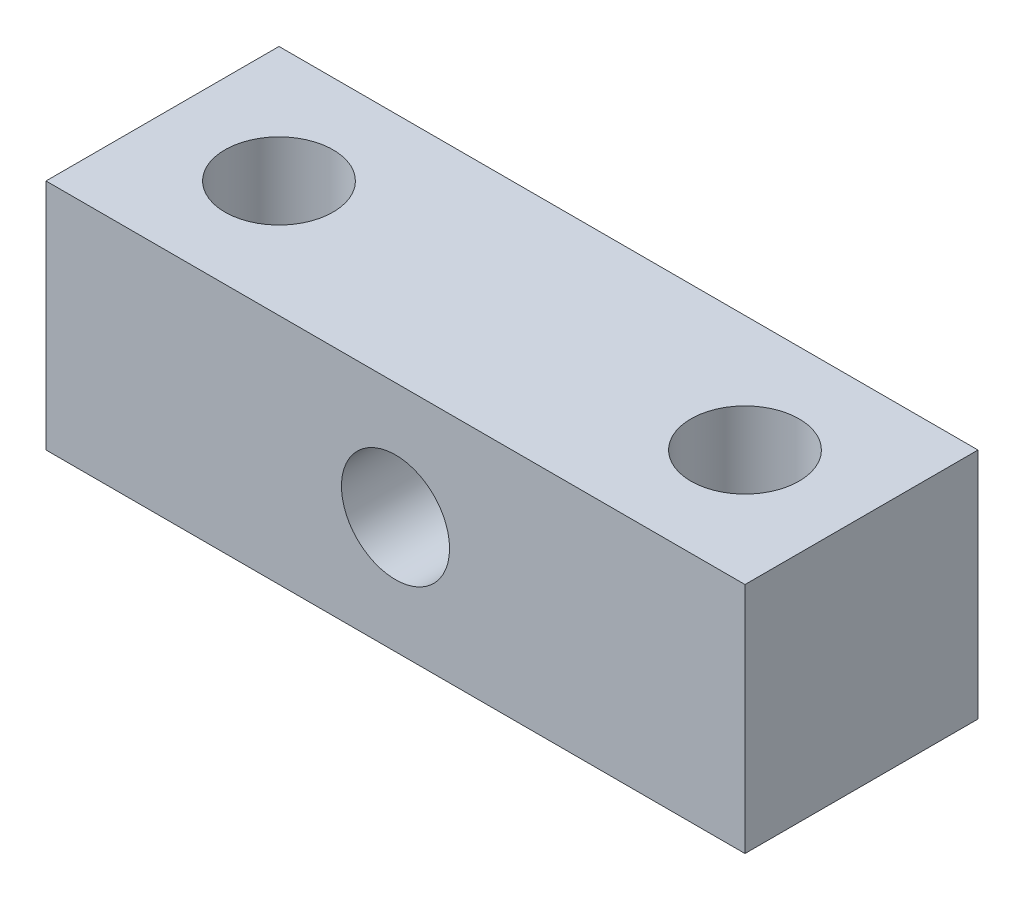
ISO-10303-21;
HEADER;
FILE_DESCRIPTION(('STEP AP214'),'2;1');
FILE_NAME('part.step','',(''),(''),'','','');
FILE_SCHEMA(('AUTOMOTIVE_DESIGN { 1 0 10303 214 1 1 1 1 }'));
ENDSEC;
DATA;
#1=APPLICATION_CONTEXT('core data for automotive mechanical design processes');
#2=APPLICATION_PROTOCOL_DEFINITION('international standard','automotive_design',2000,#1);
#3=PRODUCT_CONTEXT('',#1,'mechanical');
#4=PRODUCT('Part','Part','',(#3));
#5=PRODUCT_RELATED_PRODUCT_CATEGORY('part','',(#4));
#6=PRODUCT_DEFINITION_FORMATION('','',#4);
#7=PRODUCT_DEFINITION_CONTEXT('part definition',#1,'design');
#8=PRODUCT_DEFINITION('design','',#6,#7);
#9=PRODUCT_DEFINITION_SHAPE('','',#8);
#10=(LENGTH_UNIT() NAMED_UNIT(*) SI_UNIT(.MILLI.,.METRE.));
#11=(NAMED_UNIT(*) PLANE_ANGLE_UNIT() SI_UNIT($,.RADIAN.));
#12=(NAMED_UNIT(*) SI_UNIT($,.STERADIAN.) SOLID_ANGLE_UNIT());
#13=UNCERTAINTY_MEASURE_WITH_UNIT(LENGTH_MEASURE(1.E-05),#10,'distance_accuracy_value','');
#14=(GEOMETRIC_REPRESENTATION_CONTEXT(3) GLOBAL_UNCERTAINTY_ASSIGNED_CONTEXT((#13)) GLOBAL_UNIT_ASSIGNED_CONTEXT((#10,
#11,#12)) REPRESENTATION_CONTEXT('',''));
#15=CARTESIAN_POINT('',(0.,0.,0.));
#16=DIRECTION('',(0.,0.,1.));
#17=DIRECTION('',(1.,0.,0.));
#18=AXIS2_PLACEMENT_3D('',#15,#16,#17);
#19=CARTESIAN_POINT('',(-9.525,3.175,6.35));
#20=DIRECTION('',(1.,0.,0.));
#21=DIRECTION('',(0.,0.,-1.));
#22=AXIS2_PLACEMENT_3D('',#19,#20,#21);
#23=PLANE('',#22);
#24=DIRECTION('',(0.,-1.,0.));
#25=VECTOR('',#24,1.);
#26=CARTESIAN_POINT('',(-9.525,3.175,0.));
#27=LINE('',#26,#25);
#28=CARTESIAN_POINT('',(-9.525,3.175,0.));
#29=VERTEX_POINT('',#28);
#30=CARTESIAN_POINT('',(-9.525,-3.175,0.));
#31=VERTEX_POINT('',#30);
#32=EDGE_CURVE('E98',#29,#31,#27,.T.);
#33=ORIENTED_EDGE('',*,*,#32,.T.);
#34=DIRECTION('',(0.,0.,-1.));
#35=VECTOR('',#34,1.);
#36=CARTESIAN_POINT('',(-9.525,-3.175,6.35));
#37=LINE('',#36,#35);
#38=CARTESIAN_POINT('',(-9.525,-3.175,6.35));
#39=VERTEX_POINT('',#38);
#40=EDGE_CURVE('E11',#39,#31,#37,.T.);
#41=ORIENTED_EDGE('',*,*,#40,.F.);
#42=DIRECTION('',(0.,-1.,0.));
#43=VECTOR('',#42,1.);
#44=CARTESIAN_POINT('',(-9.525,3.175,6.35));
#45=LINE('',#44,#43);
#46=CARTESIAN_POINT('',(-9.525,3.175,6.35));
#47=VERTEX_POINT('',#46);
#48=EDGE_CURVE('E86',#47,#39,#45,.T.);
#49=ORIENTED_EDGE('',*,*,#48,.F.);
#50=DIRECTION('',(0.,0.,-1.));
#51=VECTOR('',#50,1.);
#52=CARTESIAN_POINT('',(-9.525,3.175,6.35));
#53=LINE('',#52,#51);
#54=EDGE_CURVE('E94',#47,#29,#53,.T.);
#55=ORIENTED_EDGE('',*,*,#54,.T.);
#56=EDGE_LOOP('',(#33,#41,#49,#55));
#57=FACE_BOUND('',#56,.T.);
#58=ADVANCED_FACE('F35',(#57),#23,.F.);
#59=CARTESIAN_POINT('',(-9.525,-3.175,6.35));
#60=DIRECTION('',(0.,1.,0.));
#61=DIRECTION('',(0.,0.,1.));
#62=AXIS2_PLACEMENT_3D('',#59,#60,#61);
#63=PLANE('',#62);
#64=CARTESIAN_POINT('',(-6.35,-3.175,3.175));
#65=DIRECTION('',(0.,1.,0.));
#66=DIRECTION('',(0.,0.,1.));
#67=AXIS2_PLACEMENT_3D('',#64,#65,#66);
#68=CIRCLE('',#67,1.4732);
#69=CARTESIAN_POINT('',(-6.35,-3.175,4.6482));
#70=VERTEX_POINT('',#69);
#71=EDGE_CURVE('E117',#70,#70,#68,.T.);
#72=ORIENTED_EDGE('',*,*,#71,.T.);
#73=EDGE_LOOP('',(#72));
#74=FACE_BOUND('',#73,.T.);
#75=CARTESIAN_POINT('',(6.35,-3.175,3.175));
#76=DIRECTION('',(0.,1.,0.));
#77=DIRECTION('',(0.,0.,1.));
#78=AXIS2_PLACEMENT_3D('',#75,#76,#77);
#79=CIRCLE('',#78,1.4732);
#80=CARTESIAN_POINT('',(6.35,-3.175,4.6482));
#81=VERTEX_POINT('',#80);
#82=EDGE_CURVE('E101',#81,#81,#79,.T.);
#83=ORIENTED_EDGE('',*,*,#82,.T.);
#84=EDGE_LOOP('',(#83));
#85=FACE_BOUND('',#84,.T.);
#86=DIRECTION('',(1.,0.,0.));
#87=VECTOR('',#86,1.);
#88=CARTESIAN_POINT('',(-9.525,-3.175,0.));
#89=LINE('',#88,#87);
#90=CARTESIAN_POINT('',(9.525,-3.175,0.));
#91=VERTEX_POINT('',#90);
#92=EDGE_CURVE('E90',#31,#91,#89,.T.);
#93=ORIENTED_EDGE('',*,*,#92,.T.);
#94=DIRECTION('',(0.,0.,-1.));
#95=VECTOR('',#94,1.);
#96=CARTESIAN_POINT('',(9.525,-3.175,6.35));
#97=LINE('',#96,#95);
#98=CARTESIAN_POINT('',(9.525,-3.175,6.35));
#99=VERTEX_POINT('',#98);
#100=EDGE_CURVE('E43',#99,#91,#97,.T.);
#101=ORIENTED_EDGE('',*,*,#100,.F.);
#102=DIRECTION('',(1.,0.,0.));
#103=VECTOR('',#102,1.);
#104=CARTESIAN_POINT('',(-9.525,-3.175,6.35));
#105=LINE('',#104,#103);
#106=EDGE_CURVE('E81',#39,#99,#105,.T.);
#107=ORIENTED_EDGE('',*,*,#106,.F.);
#108=ORIENTED_EDGE('',*,*,#40,.T.);
#109=EDGE_LOOP('',(#93,#101,#107,#108));
#110=FACE_BOUND('',#109,.T.);
#111=ADVANCED_FACE('F89',(#74,#85,#110),#63,.F.);
#112=CARTESIAN_POINT('',(9.525,3.175,6.35));
#113=DIRECTION('',(-1.,0.,0.));
#114=DIRECTION('',(0.,0.,1.));
#115=AXIS2_PLACEMENT_3D('',#112,#113,#114);
#116=PLANE('',#115);
#117=DIRECTION('',(0.,1.,0.));
#118=VECTOR('',#117,1.);
#119=CARTESIAN_POINT('',(9.525,3.175,0.));
#120=LINE('',#119,#118);
#121=CARTESIAN_POINT('',(9.525,3.175,0.));
#122=VERTEX_POINT('',#121);
#123=EDGE_CURVE('E68',#91,#122,#120,.T.);
#124=ORIENTED_EDGE('',*,*,#123,.T.);
#125=DIRECTION('',(0.,0.,-1.));
#126=VECTOR('',#125,1.);
#127=CARTESIAN_POINT('',(9.525,3.175,6.35));
#128=LINE('',#127,#126);
#129=CARTESIAN_POINT('',(9.525,3.175,6.35));
#130=VERTEX_POINT('',#129);
#131=EDGE_CURVE('E91',#130,#122,#128,.T.);
#132=ORIENTED_EDGE('',*,*,#131,.F.);
#133=DIRECTION('',(0.,1.,0.));
#134=VECTOR('',#133,1.);
#135=CARTESIAN_POINT('',(9.525,3.175,6.35));
#136=LINE('',#135,#134);
#137=EDGE_CURVE('E84',#99,#130,#136,.T.);
#138=ORIENTED_EDGE('',*,*,#137,.F.);
#139=ORIENTED_EDGE('',*,*,#100,.T.);
#140=EDGE_LOOP('',(#124,#132,#138,#139));
#141=FACE_BOUND('',#140,.T.);
#142=ADVANCED_FACE('F92',(#141),#116,.F.);
#143=CARTESIAN_POINT('',(-9.525,3.175,6.35));
#144=DIRECTION('',(0.,-1.,0.));
#145=DIRECTION('',(0.,0.,-1.));
#146=AXIS2_PLACEMENT_3D('',#143,#144,#145);
#147=PLANE('',#146);
#148=CARTESIAN_POINT('',(-6.35,3.175,3.175));
#149=DIRECTION('',(0.,1.,0.));
#150=DIRECTION('',(0.,0.,1.));
#151=AXIS2_PLACEMENT_3D('',#148,#149,#150);
#152=CIRCLE('',#151,1.47319999999999);
#153=CARTESIAN_POINT('',(-6.35,3.175,4.64819999999999));
#154=VERTEX_POINT('',#153);
#155=EDGE_CURVE('E120',#154,#154,#152,.T.);
#156=ORIENTED_EDGE('',*,*,#155,.F.);
#157=EDGE_LOOP('',(#156));
#158=FACE_BOUND('',#157,.T.);
#159=CARTESIAN_POINT('',(6.35,3.175,3.175));
#160=DIRECTION('',(0.,1.,0.));
#161=DIRECTION('',(0.,0.,1.));
#162=AXIS2_PLACEMENT_3D('',#159,#160,#161);
#163=CIRCLE('',#162,1.47319999999999);
#164=CARTESIAN_POINT('',(6.35,3.175,4.64819999999999));
#165=VERTEX_POINT('',#164);
#166=EDGE_CURVE('E114',#165,#165,#163,.T.);
#167=ORIENTED_EDGE('',*,*,#166,.F.);
#168=EDGE_LOOP('',(#167));
#169=FACE_BOUND('',#168,.T.);
#170=DIRECTION('',(-1.,0.,0.));
#171=VECTOR('',#170,1.);
#172=CARTESIAN_POINT('',(-9.525,3.175,0.));
#173=LINE('',#172,#171);
#174=EDGE_CURVE('E74',#122,#29,#173,.T.);
#175=ORIENTED_EDGE('',*,*,#174,.T.);
#176=ORIENTED_EDGE('',*,*,#54,.F.);
#177=DIRECTION('',(-1.,0.,0.));
#178=VECTOR('',#177,1.);
#179=CARTESIAN_POINT('',(-9.525,3.175,6.35));
#180=LINE('',#179,#178);
#181=EDGE_CURVE('E51',#130,#47,#180,.T.);
#182=ORIENTED_EDGE('',*,*,#181,.F.);
#183=ORIENTED_EDGE('',*,*,#131,.T.);
#184=EDGE_LOOP('',(#175,#176,#182,#183));
#185=FACE_BOUND('',#184,.T.);
#186=ADVANCED_FACE('F106',(#158,#169,#185),#147,.F.);
#187=CARTESIAN_POINT('',(0.,0.,6.35));
#188=DIRECTION('',(0.,0.,1.));
#189=DIRECTION('',(1.,0.,0.));
#190=AXIS2_PLACEMENT_3D('',#187,#188,#189);
#191=PLANE('',#190);
#192=CARTESIAN_POINT('',(0.,0.,6.35));
#193=DIRECTION('',(0.,0.,1.));
#194=DIRECTION('',(1.,0.,0.));
#195=AXIS2_PLACEMENT_3D('',#192,#193,#194);
#196=CIRCLE('',#195,1.47319999999999);
#197=CARTESIAN_POINT('',(1.47319999999999,0.,6.35));
#198=VERTEX_POINT('',#197);
#199=EDGE_CURVE('E126',#198,#198,#196,.T.);
#200=ORIENTED_EDGE('',*,*,#199,.F.);
#201=EDGE_LOOP('',(#200));
#202=FACE_BOUND('',#201,.T.);
#203=ORIENTED_EDGE('',*,*,#48,.T.);
#204=ORIENTED_EDGE('',*,*,#106,.T.);
#205=ORIENTED_EDGE('',*,*,#137,.T.);
#206=ORIENTED_EDGE('',*,*,#181,.T.);
#207=EDGE_LOOP('',(#203,#204,#205,#206));
#208=FACE_BOUND('',#207,.T.);
#209=ADVANCED_FACE('F82',(#202,#208),#191,.T.);
#210=CARTESIAN_POINT('',(0.,0.,0.));
#211=DIRECTION('',(0.,0.,1.));
#212=DIRECTION('',(1.,0.,0.));
#213=AXIS2_PLACEMENT_3D('',#210,#211,#212);
#214=PLANE('',#213);
#215=CARTESIAN_POINT('',(0.,0.,0.));
#216=DIRECTION('',(0.,0.,1.));
#217=DIRECTION('',(1.,0.,0.));
#218=AXIS2_PLACEMENT_3D('',#215,#216,#217);
#219=CIRCLE('',#218,1.4732);
#220=CARTESIAN_POINT('',(1.4732,0.,0.));
#221=VERTEX_POINT('',#220);
#222=EDGE_CURVE('E123',#221,#221,#219,.T.);
#223=ORIENTED_EDGE('',*,*,#222,.T.);
#224=EDGE_LOOP('',(#223));
#225=FACE_BOUND('',#224,.T.);
#226=ORIENTED_EDGE('',*,*,#32,.F.);
#227=ORIENTED_EDGE('',*,*,#174,.F.);
#228=ORIENTED_EDGE('',*,*,#123,.F.);
#229=ORIENTED_EDGE('',*,*,#92,.F.);
#230=EDGE_LOOP('',(#226,#227,#228,#229));
#231=FACE_BOUND('',#230,.T.);
#232=ADVANCED_FACE('F109',(#225,#231),#214,.F.);
#233=CARTESIAN_POINT('',(6.35,3.175,3.175));
#234=DIRECTION('',(0.,1.,0.));
#235=DIRECTION('',(0.,0.,1.));
#236=AXIS2_PLACEMENT_3D('',#233,#234,#235);
#237=CYLINDRICAL_SURFACE('',#236,1.47319999999999);
#238=ORIENTED_EDGE('',*,*,#82,.F.);
#239=EDGE_LOOP('',(#238));
#240=FACE_BOUND('',#239,.T.);
#241=ORIENTED_EDGE('',*,*,#166,.T.);
#242=EDGE_LOOP('',(#241));
#243=FACE_BOUND('',#242,.T.);
#244=ADVANCED_FACE('F138',(#240,#243),#237,.F.);
#245=CARTESIAN_POINT('',(-6.35,3.175,3.175));
#246=DIRECTION('',(0.,1.,0.));
#247=DIRECTION('',(0.,0.,1.));
#248=AXIS2_PLACEMENT_3D('',#245,#246,#247);
#249=CYLINDRICAL_SURFACE('',#248,1.47319999999999);
#250=ORIENTED_EDGE('',*,*,#71,.F.);
#251=EDGE_LOOP('',(#250));
#252=FACE_BOUND('',#251,.T.);
#253=ORIENTED_EDGE('',*,*,#155,.T.);
#254=EDGE_LOOP('',(#253));
#255=FACE_BOUND('',#254,.T.);
#256=ADVANCED_FACE('F159',(#252,#255),#249,.F.);
#257=CARTESIAN_POINT('',(0.,0.,6.35));
#258=DIRECTION('',(0.,0.,1.));
#259=DIRECTION('',(1.,0.,0.));
#260=AXIS2_PLACEMENT_3D('',#257,#258,#259);
#261=CYLINDRICAL_SURFACE('',#260,1.47319999999999);
#262=ORIENTED_EDGE('',*,*,#222,.F.);
#263=EDGE_LOOP('',(#262));
#264=FACE_BOUND('',#263,.T.);
#265=ORIENTED_EDGE('',*,*,#199,.T.);
#266=EDGE_LOOP('',(#265));
#267=FACE_BOUND('',#266,.T.);
#268=ADVANCED_FACE('F130',(#264,#267),#261,.F.);
#269=CLOSED_SHELL('',(#58,#111,#142,#186,#209,#232,#244,#256,#268));
#270=MANIFOLD_SOLID_BREP('B2',#269);
#271=ADVANCED_BREP_SHAPE_REPRESENTATION('',(#18,#270),#14);
#272=SHAPE_DEFINITION_REPRESENTATION(#9,#271);
ENDSEC;
END-ISO-10303-21;
